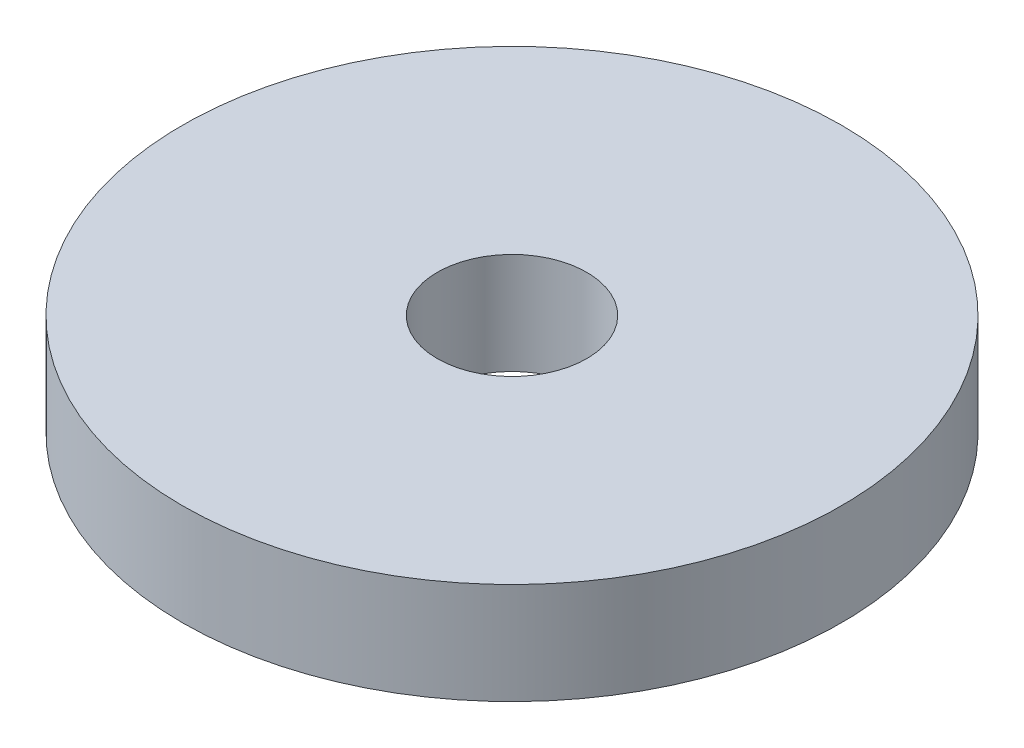
ISO-10303-21;
HEADER;
FILE_DESCRIPTION(('STEP AP214'),'2;1');
FILE_NAME('part.step','',(''),(''),'','','');
FILE_SCHEMA(('AUTOMOTIVE_DESIGN { 1 0 10303 214 1 1 1 1 }'));
ENDSEC;
DATA;
#1=APPLICATION_CONTEXT('core data for automotive mechanical design processes');
#2=APPLICATION_PROTOCOL_DEFINITION('international standard','automotive_design',2000,#1);
#3=PRODUCT_CONTEXT('',#1,'mechanical');
#4=PRODUCT('Part','Part','',(#3));
#5=PRODUCT_RELATED_PRODUCT_CATEGORY('part','',(#4));
#6=PRODUCT_DEFINITION_FORMATION('','',#4);
#7=PRODUCT_DEFINITION_CONTEXT('part definition',#1,'design');
#8=PRODUCT_DEFINITION('design','',#6,#7);
#9=PRODUCT_DEFINITION_SHAPE('','',#8);
#10=(LENGTH_UNIT() NAMED_UNIT(*) SI_UNIT(.MILLI.,.METRE.));
#11=(NAMED_UNIT(*) PLANE_ANGLE_UNIT() SI_UNIT($,.RADIAN.));
#12=(NAMED_UNIT(*) SI_UNIT($,.STERADIAN.) SOLID_ANGLE_UNIT());
#13=UNCERTAINTY_MEASURE_WITH_UNIT(LENGTH_MEASURE(1.E-05),#10,'distance_accuracy_value','');
#14=(GEOMETRIC_REPRESENTATION_CONTEXT(3) GLOBAL_UNCERTAINTY_ASSIGNED_CONTEXT((#13)) GLOBAL_UNIT_ASSIGNED_CONTEXT((#10,
#11,#12)) REPRESENTATION_CONTEXT('',''));
#15=CARTESIAN_POINT('',(0.,0.,0.));
#16=DIRECTION('',(0.,0.,1.));
#17=DIRECTION('',(1.,0.,0.));
#18=AXIS2_PLACEMENT_3D('',#15,#16,#17);
#19=CARTESIAN_POINT('',(0.,2.,0.));
#20=DIRECTION('',(0.,1.,0.));
#21=DIRECTION('',(0.,0.,1.));
#22=AXIS2_PLACEMENT_3D('',#19,#20,#21);
#23=PLANE('',#22);
#24=CARTESIAN_POINT('',(0.,2.,0.));
#25=DIRECTION('',(0.,1.,0.));
#26=DIRECTION('',(0.,0.,1.));
#27=AXIS2_PLACEMENT_3D('',#24,#25,#26);
#28=CIRCLE('',#27,6.5);
#29=CARTESIAN_POINT('',(0.,2.,6.5));
#30=VERTEX_POINT('',#29);
#31=EDGE_CURVE('E10',#30,#30,#28,.T.);
#32=ORIENTED_EDGE('',*,*,#31,.T.);
#33=EDGE_LOOP('',(#32));
#34=FACE_BOUND('',#33,.T.);
#35=CARTESIAN_POINT('',(0.,2.,0.));
#36=DIRECTION('',(0.,1.,0.));
#37=DIRECTION('',(0.,0.,1.));
#38=AXIS2_PLACEMENT_3D('',#35,#36,#37);
#39=CIRCLE('',#38,1.475);
#40=CARTESIAN_POINT('',(0.,2.,1.475));
#41=VERTEX_POINT('',#40);
#42=EDGE_CURVE('E45',#41,#41,#39,.T.);
#43=ORIENTED_EDGE('',*,*,#42,.F.);
#44=EDGE_LOOP('',(#43));
#45=FACE_BOUND('',#44,.T.);
#46=ADVANCED_FACE('F34',(#34,#45),#23,.T.);
#47=CARTESIAN_POINT('',(0.,0.,0.));
#48=DIRECTION('',(0.,1.,0.));
#49=DIRECTION('',(0.,0.,1.));
#50=AXIS2_PLACEMENT_3D('',#47,#48,#49);
#51=PLANE('',#50);
#52=CARTESIAN_POINT('',(0.,0.,0.));
#53=DIRECTION('',(0.,1.,0.));
#54=DIRECTION('',(0.,0.,1.));
#55=AXIS2_PLACEMENT_3D('',#52,#53,#54);
#56=CIRCLE('',#55,6.5);
#57=CARTESIAN_POINT('',(0.,0.,6.5));
#58=VERTEX_POINT('',#57);
#59=EDGE_CURVE('E38',#58,#58,#56,.T.);
#60=ORIENTED_EDGE('',*,*,#59,.F.);
#61=EDGE_LOOP('',(#60));
#62=FACE_BOUND('',#61,.T.);
#63=CARTESIAN_POINT('',(0.,0.,0.));
#64=DIRECTION('',(0.,1.,0.));
#65=DIRECTION('',(0.,0.,1.));
#66=AXIS2_PLACEMENT_3D('',#63,#64,#65);
#67=CIRCLE('',#66,1.475);
#68=CARTESIAN_POINT('',(0.,0.,1.475));
#69=VERTEX_POINT('',#68);
#70=EDGE_CURVE('E47',#69,#69,#67,.T.);
#71=ORIENTED_EDGE('',*,*,#70,.T.);
#72=EDGE_LOOP('',(#71));
#73=FACE_BOUND('',#72,.T.);
#74=ADVANCED_FACE('F57',(#62,#73),#51,.F.);
#75=CARTESIAN_POINT('',(0.,2.,0.));
#76=DIRECTION('',(0.,-1.,0.));
#77=DIRECTION('',(0.,0.,-1.));
#78=AXIS2_PLACEMENT_3D('',#75,#76,#77);
#79=CYLINDRICAL_SURFACE('',#78,6.5);
#80=ORIENTED_EDGE('',*,*,#31,.F.);
#81=EDGE_LOOP('',(#80));
#82=FACE_BOUND('',#81,.T.);
#83=ORIENTED_EDGE('',*,*,#59,.T.);
#84=EDGE_LOOP('',(#83));
#85=FACE_BOUND('',#84,.T.);
#86=ADVANCED_FACE('F36',(#82,#85),#79,.T.);
#87=CARTESIAN_POINT('',(0.,2.,0.));
#88=DIRECTION('',(0.,-1.,0.));
#89=DIRECTION('',(0.,0.,-1.));
#90=AXIS2_PLACEMENT_3D('',#87,#88,#89);
#91=CYLINDRICAL_SURFACE('',#90,1.475);
#92=ORIENTED_EDGE('',*,*,#42,.T.);
#93=EDGE_LOOP('',(#92));
#94=FACE_BOUND('',#93,.T.);
#95=ORIENTED_EDGE('',*,*,#70,.F.);
#96=EDGE_LOOP('',(#95));
#97=FACE_BOUND('',#96,.T.);
#98=ADVANCED_FACE('F53',(#94,#97),#91,.F.);
#99=CLOSED_SHELL('',(#46,#74,#86,#98));
#100=MANIFOLD_SOLID_BREP('B2',#99);
#101=ADVANCED_BREP_SHAPE_REPRESENTATION('',(#18,#100),#14);
#102=SHAPE_DEFINITION_REPRESENTATION(#9,#101);
ENDSEC;
END-ISO-10303-21;
